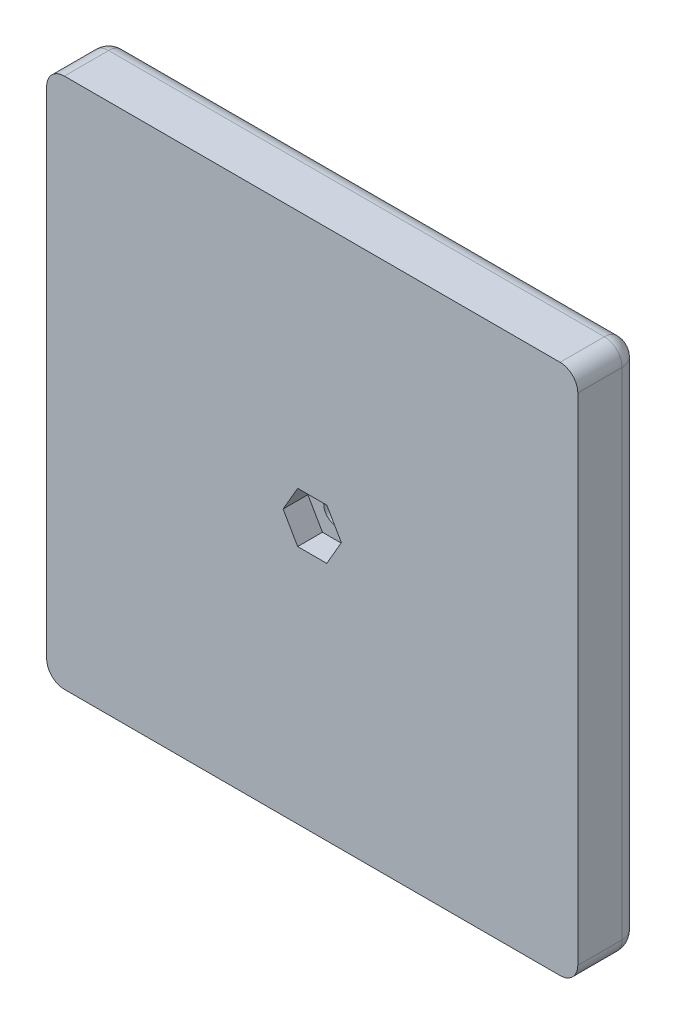
ISO-10303-21;
HEADER;
FILE_DESCRIPTION(('STEP AP214'),'2;1');
FILE_NAME('part.step','',(''),(''),'','','');
FILE_SCHEMA(('AUTOMOTIVE_DESIGN { 1 0 10303 214 1 1 1 1 }'));
ENDSEC;
DATA;
#1=APPLICATION_CONTEXT('core data for automotive mechanical design processes');
#2=APPLICATION_PROTOCOL_DEFINITION('international standard','automotive_design',2000,#1);
#3=PRODUCT_CONTEXT('',#1,'mechanical');
#4=PRODUCT('Part','Part','',(#3));
#5=PRODUCT_RELATED_PRODUCT_CATEGORY('part','',(#4));
#6=PRODUCT_DEFINITION_FORMATION('','',#4);
#7=PRODUCT_DEFINITION_CONTEXT('part definition',#1,'design');
#8=PRODUCT_DEFINITION('design','',#6,#7);
#9=PRODUCT_DEFINITION_SHAPE('','',#8);
#10=(LENGTH_UNIT() NAMED_UNIT(*) SI_UNIT(.MILLI.,.METRE.));
#11=(NAMED_UNIT(*) PLANE_ANGLE_UNIT() SI_UNIT($,.RADIAN.));
#12=(NAMED_UNIT(*) SI_UNIT($,.STERADIAN.) SOLID_ANGLE_UNIT());
#13=UNCERTAINTY_MEASURE_WITH_UNIT(LENGTH_MEASURE(1.E-05),#10,'distance_accuracy_value','');
#14=(GEOMETRIC_REPRESENTATION_CONTEXT(3) GLOBAL_UNCERTAINTY_ASSIGNED_CONTEXT((#13)) GLOBAL_UNIT_ASSIGNED_CONTEXT((#10,
#11,#12)) REPRESENTATION_CONTEXT('',''));
#15=CARTESIAN_POINT('',(0.,0.,0.));
#16=DIRECTION('',(0.,0.,1.));
#17=DIRECTION('',(1.,0.,0.));
#18=AXIS2_PLACEMENT_3D('',#15,#16,#17);
#19=CARTESIAN_POINT('',(0.,0.,17.251));
#20=DIRECTION('',(0.,0.,-1.));
#21=DIRECTION('',(-1.,0.,0.));
#22=AXIS2_PLACEMENT_3D('',#19,#20,#21);
#23=CYLINDRICAL_SURFACE('',#22,1.5);
#24=CARTESIAN_POINT('',(0.,0.,10.25));
#25=DIRECTION('',(0.,0.,-1.));
#26=DIRECTION('',(-1.,0.,0.));
#27=AXIS2_PLACEMENT_3D('',#24,#25,#26);
#28=CIRCLE('',#27,1.5);
#29=CARTESIAN_POINT('',(-1.5,0.,10.25));
#30=VERTEX_POINT('',#29);
#31=EDGE_CURVE('E240',#30,#30,#28,.T.);
#32=ORIENTED_EDGE('',*,*,#31,.T.);
#33=EDGE_LOOP('',(#32));
#34=FACE_BOUND('',#33,.T.);
#35=CARTESIAN_POINT('',(0.,0.,14.45));
#36=DIRECTION('',(0.,0.,1.));
#37=DIRECTION('',(1.,0.,0.));
#38=AXIS2_PLACEMENT_3D('',#35,#36,#37);
#39=CIRCLE('',#38,1.5);
#40=CARTESIAN_POINT('',(1.5,0.,14.45));
#41=VERTEX_POINT('',#40);
#42=EDGE_CURVE('E232',#41,#41,#39,.F.);
#43=ORIENTED_EDGE('',*,*,#42,.F.);
#44=EDGE_LOOP('',(#43));
#45=FACE_BOUND('',#44,.T.);
#46=ADVANCED_FACE('F39',(#34,#45),#23,.F.);
#47=CARTESIAN_POINT('',(11.5,-11.5,10.25));
#48=DIRECTION('',(-1.,0.,0.));
#49=DIRECTION('',(0.,0.,1.));
#50=AXIS2_PLACEMENT_3D('',#47,#48,#49);
#51=PLANE('',#50);
#52=DIRECTION('',(0.,1.,0.));
#53=VECTOR('',#52,1.);
#54=CARTESIAN_POINT('',(11.5,-11.5,0.));
#55=LINE('',#54,#53);
#56=CARTESIAN_POINT('',(11.5,-11.5,0.));
#57=VERTEX_POINT('',#56);
#58=CARTESIAN_POINT('',(11.5,11.5,0.));
#59=VERTEX_POINT('',#58);
#60=EDGE_CURVE('E257',#57,#59,#55,.T.);
#61=ORIENTED_EDGE('',*,*,#60,.T.);
#62=DIRECTION('',(0.,0.,-1.));
#63=VECTOR('',#62,1.);
#64=CARTESIAN_POINT('',(11.5,11.5,10.25));
#65=LINE('',#64,#63);
#66=CARTESIAN_POINT('',(11.5,11.5,10.25));
#67=VERTEX_POINT('',#66);
#68=EDGE_CURVE('E289',#67,#59,#65,.T.);
#69=ORIENTED_EDGE('',*,*,#68,.F.);
#70=DIRECTION('',(0.,1.,0.));
#71=VECTOR('',#70,1.);
#72=CARTESIAN_POINT('',(11.5,-11.5,10.25));
#73=LINE('',#72,#71);
#74=CARTESIAN_POINT('',(11.5,-11.5,10.25));
#75=VERTEX_POINT('',#74);
#76=EDGE_CURVE('E260',#75,#67,#73,.T.);
#77=ORIENTED_EDGE('',*,*,#76,.F.);
#78=DIRECTION('',(0.,0.,-1.));
#79=VECTOR('',#78,1.);
#80=CARTESIAN_POINT('',(11.5,-11.5,10.25));
#81=LINE('',#80,#79);
#82=EDGE_CURVE('E273',#75,#57,#81,.T.);
#83=ORIENTED_EDGE('',*,*,#82,.T.);
#84=EDGE_LOOP('',(#61,#69,#77,#83));
#85=FACE_BOUND('',#84,.T.);
#86=ADVANCED_FACE('F433',(#85),#51,.F.);
#87=CARTESIAN_POINT('',(-11.5,11.5,10.25));
#88=DIRECTION('',(0.,-1.,0.));
#89=DIRECTION('',(0.,0.,-1.));
#90=AXIS2_PLACEMENT_3D('',#87,#88,#89);
#91=PLANE('',#90);
#92=DIRECTION('',(-1.,0.,0.));
#93=VECTOR('',#92,1.);
#94=CARTESIAN_POINT('',(-11.5,11.5,0.));
#95=LINE('',#94,#93);
#96=CARTESIAN_POINT('',(-11.5,11.5,0.));
#97=VERTEX_POINT('',#96);
#98=EDGE_CURVE('E276',#59,#97,#95,.T.);
#99=ORIENTED_EDGE('',*,*,#98,.T.);
#100=DIRECTION('',(0.,0.,-1.));
#101=VECTOR('',#100,1.);
#102=CARTESIAN_POINT('',(-11.5,11.5,10.25));
#103=LINE('',#102,#101);
#104=CARTESIAN_POINT('',(-11.5,11.5,10.25));
#105=VERTEX_POINT('',#104);
#106=EDGE_CURVE('E286',#105,#97,#103,.T.);
#107=ORIENTED_EDGE('',*,*,#106,.F.);
#108=DIRECTION('',(-1.,0.,0.));
#109=VECTOR('',#108,1.);
#110=CARTESIAN_POINT('',(-11.5,11.5,10.25));
#111=LINE('',#110,#109);
#112=EDGE_CURVE('E263',#67,#105,#111,.T.);
#113=ORIENTED_EDGE('',*,*,#112,.F.);
#114=ORIENTED_EDGE('',*,*,#68,.T.);
#115=EDGE_LOOP('',(#99,#107,#113,#114));
#116=FACE_BOUND('',#115,.T.);
#117=ADVANCED_FACE('F439',(#116),#91,.F.);
#118=CARTESIAN_POINT('',(-11.5,-11.5,10.25));
#119=DIRECTION('',(1.,0.,0.));
#120=DIRECTION('',(0.,0.,-1.));
#121=AXIS2_PLACEMENT_3D('',#118,#119,#120);
#122=PLANE('',#121);
#123=DIRECTION('',(0.,-1.,0.));
#124=VECTOR('',#123,1.);
#125=CARTESIAN_POINT('',(-11.5,-11.5,0.));
#126=LINE('',#125,#124);
#127=CARTESIAN_POINT('',(-11.5,-11.5,0.));
#128=VERTEX_POINT('',#127);
#129=EDGE_CURVE('E278',#97,#128,#126,.T.);
#130=ORIENTED_EDGE('',*,*,#129,.T.);
#131=DIRECTION('',(0.,0.,-1.));
#132=VECTOR('',#131,1.);
#133=CARTESIAN_POINT('',(-11.5,-11.5,10.25));
#134=LINE('',#133,#132);
#135=CARTESIAN_POINT('',(-11.5,-11.5,10.25));
#136=VERTEX_POINT('',#135);
#137=EDGE_CURVE('E283',#136,#128,#134,.T.);
#138=ORIENTED_EDGE('',*,*,#137,.F.);
#139=DIRECTION('',(0.,-1.,0.));
#140=VECTOR('',#139,1.);
#141=CARTESIAN_POINT('',(-11.5,-11.5,10.25));
#142=LINE('',#141,#140);
#143=EDGE_CURVE('E267',#105,#136,#142,.T.);
#144=ORIENTED_EDGE('',*,*,#143,.F.);
#145=ORIENTED_EDGE('',*,*,#106,.T.);
#146=EDGE_LOOP('',(#130,#138,#144,#145));
#147=FACE_BOUND('',#146,.T.);
#148=ADVANCED_FACE('F474',(#147),#122,.F.);
#149=CARTESIAN_POINT('',(-11.5,-11.5,10.25));
#150=DIRECTION('',(0.,1.,0.));
#151=DIRECTION('',(0.,0.,1.));
#152=AXIS2_PLACEMENT_3D('',#149,#150,#151);
#153=PLANE('',#152);
#154=DIRECTION('',(1.,0.,0.));
#155=VECTOR('',#154,1.);
#156=CARTESIAN_POINT('',(-11.5,-11.5,0.));
#157=LINE('',#156,#155);
#158=EDGE_CURVE('E264',#128,#57,#157,.T.);
#159=ORIENTED_EDGE('',*,*,#158,.T.);
#160=ORIENTED_EDGE('',*,*,#82,.F.);
#161=DIRECTION('',(1.,0.,0.));
#162=VECTOR('',#161,1.);
#163=CARTESIAN_POINT('',(-11.5,-11.5,10.25));
#164=LINE('',#163,#162);
#165=EDGE_CURVE('E270',#136,#75,#164,.T.);
#166=ORIENTED_EDGE('',*,*,#165,.F.);
#167=ORIENTED_EDGE('',*,*,#137,.T.);
#168=EDGE_LOOP('',(#159,#160,#166,#167));
#169=FACE_BOUND('',#168,.T.);
#170=ADVANCED_FACE('F470',(#169),#153,.F.);
#171=CARTESIAN_POINT('',(0.,0.,0.));
#172=DIRECTION('',(0.,0.,-1.));
#173=DIRECTION('',(-1.,0.,0.));
#174=AXIS2_PLACEMENT_3D('',#171,#172,#173);
#175=PLANE('',#174);
#176=CARTESIAN_POINT('',(0.,0.,0.));
#177=DIRECTION('',(0.,0.,-1.));
#178=DIRECTION('',(-1.,0.,0.));
#179=AXIS2_PLACEMENT_3D('',#176,#177,#178);
#180=CIRCLE('',#179,4.2);
#181=CARTESIAN_POINT('',(-4.2,0.,0.));
#182=VERTEX_POINT('',#181);
#183=EDGE_CURVE('E254',#182,#182,#180,.T.);
#184=ORIENTED_EDGE('',*,*,#183,.F.);
#185=EDGE_LOOP('',(#184));
#186=FACE_BOUND('',#185,.T.);
#187=ORIENTED_EDGE('',*,*,#60,.F.);
#188=ORIENTED_EDGE('',*,*,#158,.F.);
#189=ORIENTED_EDGE('',*,*,#129,.F.);
#190=ORIENTED_EDGE('',*,*,#98,.F.);
#191=EDGE_LOOP('',(#187,#188,#189,#190));
#192=FACE_BOUND('',#191,.T.);
#193=ADVANCED_FACE('F466',(#186,#192),#175,.T.);
#194=CARTESIAN_POINT('',(0.,0.,10.251));
#195=DIRECTION('',(0.,0.,-1.));
#196=DIRECTION('',(-1.,0.,0.));
#197=AXIS2_PLACEMENT_3D('',#194,#195,#196);
#198=CYLINDRICAL_SURFACE('',#197,4.2);
#199=ORIENTED_EDGE('',*,*,#183,.T.);
#200=EDGE_LOOP('',(#199));
#201=FACE_BOUND('',#200,.T.);
#202=CARTESIAN_POINT('',(0.,0.,10.25));
#203=DIRECTION('',(0.,0.,-1.));
#204=DIRECTION('',(-1.,0.,0.));
#205=AXIS2_PLACEMENT_3D('',#202,#203,#204);
#206=CIRCLE('',#205,4.2);
#207=CARTESIAN_POINT('',(-4.2,0.,10.25));
#208=VERTEX_POINT('',#207);
#209=EDGE_CURVE('E253',#208,#208,#206,.F.);
#210=ORIENTED_EDGE('',*,*,#209,.T.);
#211=EDGE_LOOP('',(#210));
#212=FACE_BOUND('',#211,.T.);
#213=ADVANCED_FACE('F448',(#201,#212),#198,.F.);
#214=CARTESIAN_POINT('',(0.,0.,17.25));
#215=DIRECTION('',(0.,0.,1.));
#216=DIRECTION('',(1.,0.,0.));
#217=AXIS2_PLACEMENT_3D('',#214,#215,#216);
#218=PLANE('',#217);
#219=DIRECTION('',(0.5,0.866025403784439,0.));
#220=VECTOR('',#219,1.);
#221=CARTESIAN_POINT('',(1.64544826719043,-2.85,17.25));
#222=LINE('',#221,#220);
#223=CARTESIAN_POINT('',(1.64544826719043,-2.85,17.25));
#224=VERTEX_POINT('',#223);
#225=CARTESIAN_POINT('',(3.29089653438087,0.,17.25));
#226=VERTEX_POINT('',#225);
#227=EDGE_CURVE('E186',#224,#226,#222,.T.);
#228=ORIENTED_EDGE('',*,*,#227,.F.);
#229=DIRECTION('',(1.,0.,0.));
#230=VECTOR('',#229,1.);
#231=CARTESIAN_POINT('',(-1.64544826719043,-2.85,17.25));
#232=LINE('',#231,#230);
#233=CARTESIAN_POINT('',(-1.64544826719043,-2.85,17.25));
#234=VERTEX_POINT('',#233);
#235=EDGE_CURVE('E205',#234,#224,#232,.T.);
#236=ORIENTED_EDGE('',*,*,#235,.F.);
#237=DIRECTION('',(0.5,-0.866025403784438,0.));
#238=VECTOR('',#237,1.);
#239=CARTESIAN_POINT('',(-3.29089653438087,0.,17.25));
#240=LINE('',#239,#238);
#241=CARTESIAN_POINT('',(-3.29089653438087,0.,17.25));
#242=VERTEX_POINT('',#241);
#243=EDGE_CURVE('E208',#242,#234,#240,.T.);
#244=ORIENTED_EDGE('',*,*,#243,.F.);
#245=DIRECTION('',(-0.5,-0.866025403784438,0.));
#246=VECTOR('',#245,1.);
#247=CARTESIAN_POINT('',(-1.64544826719043,2.85,17.25));
#248=LINE('',#247,#246);
#249=CARTESIAN_POINT('',(-1.64544826719043,2.85,17.25));
#250=VERTEX_POINT('',#249);
#251=EDGE_CURVE('E225',#250,#242,#248,.T.);
#252=ORIENTED_EDGE('',*,*,#251,.F.);
#253=DIRECTION('',(-1.,0.,0.));
#254=VECTOR('',#253,1.);
#255=CARTESIAN_POINT('',(1.64544826719043,2.85,17.25));
#256=LINE('',#255,#254);
#257=CARTESIAN_POINT('',(1.64544826719043,2.85,17.25));
#258=VERTEX_POINT('',#257);
#259=EDGE_CURVE('E222',#258,#250,#256,.T.);
#260=ORIENTED_EDGE('',*,*,#259,.F.);
#261=DIRECTION('',(-0.5,0.866025403784438,0.));
#262=VECTOR('',#261,1.);
#263=CARTESIAN_POINT('',(3.29089653438087,0.,17.25));
#264=LINE('',#263,#262);
#265=EDGE_CURVE('E219',#226,#258,#264,.T.);
#266=ORIENTED_EDGE('',*,*,#265,.F.);
#267=EDGE_LOOP('',(#228,#236,#244,#252,#260,#266));
#268=FACE_BOUND('',#267,.T.);
#269=DIRECTION('',(1.,0.,0.));
#270=VECTOR('',#269,1.);
#271=CARTESIAN_POINT('',(30.,-30.,17.25));
#272=LINE('',#271,#270);
#273=CARTESIAN_POINT('',(-28.,-30.,17.25));
#274=VERTEX_POINT('',#273);
#275=CARTESIAN_POINT('',(28.,-30.,17.25));
#276=VERTEX_POINT('',#275);
#277=EDGE_CURVE('E246',#274,#276,#272,.T.);
#278=ORIENTED_EDGE('',*,*,#277,.T.);
#279=CARTESIAN_POINT('',(28.,-28.,17.25));
#280=DIRECTION('',(0.,0.,1.));
#281=DIRECTION('',(1.,0.,0.));
#282=AXIS2_PLACEMENT_3D('',#279,#280,#281);
#283=CIRCLE('',#282,2.);
#284=CARTESIAN_POINT('',(30.,-28.,17.25));
#285=VERTEX_POINT('',#284);
#286=EDGE_CURVE('E350',#276,#285,#283,.T.);
#287=ORIENTED_EDGE('',*,*,#286,.T.);
#288=DIRECTION('',(0.,1.,0.));
#289=VECTOR('',#288,1.);
#290=CARTESIAN_POINT('',(30.,-30.,17.25));
#291=LINE('',#290,#289);
#292=CARTESIAN_POINT('',(30.,28.,17.25));
#293=VERTEX_POINT('',#292);
#294=EDGE_CURVE('E249',#285,#293,#291,.T.);
#295=ORIENTED_EDGE('',*,*,#294,.T.);
#296=CARTESIAN_POINT('',(28.,28.,17.25));
#297=DIRECTION('',(0.,0.,1.));
#298=DIRECTION('',(1.,0.,0.));
#299=AXIS2_PLACEMENT_3D('',#296,#297,#298);
#300=CIRCLE('',#299,2.);
#301=CARTESIAN_POINT('',(28.,30.,17.25));
#302=VERTEX_POINT('',#301);
#303=EDGE_CURVE('E63',#293,#302,#300,.T.);
#304=ORIENTED_EDGE('',*,*,#303,.T.);
#305=DIRECTION('',(-1.,0.,0.));
#306=VECTOR('',#305,1.);
#307=CARTESIAN_POINT('',(30.,30.,17.25));
#308=LINE('',#307,#306);
#309=CARTESIAN_POINT('',(-28.,30.,17.25));
#310=VERTEX_POINT('',#309);
#311=EDGE_CURVE('E251',#302,#310,#308,.T.);
#312=ORIENTED_EDGE('',*,*,#311,.T.);
#313=CARTESIAN_POINT('',(-28.,28.,17.25));
#314=DIRECTION('',(0.,0.,1.));
#315=DIRECTION('',(1.,0.,0.));
#316=AXIS2_PLACEMENT_3D('',#313,#314,#315);
#317=CIRCLE('',#316,2.);
#318=CARTESIAN_POINT('',(-30.,28.,17.25));
#319=VERTEX_POINT('',#318);
#320=EDGE_CURVE('E347',#310,#319,#317,.T.);
#321=ORIENTED_EDGE('',*,*,#320,.T.);
#322=DIRECTION('',(0.,-1.,0.));
#323=VECTOR('',#322,1.);
#324=CARTESIAN_POINT('',(-30.,-30.,17.25));
#325=LINE('',#324,#323);
#326=CARTESIAN_POINT('',(-30.,-28.,17.25));
#327=VERTEX_POINT('',#326);
#328=EDGE_CURVE('E243',#319,#327,#325,.T.);
#329=ORIENTED_EDGE('',*,*,#328,.T.);
#330=CARTESIAN_POINT('',(-28.,-28.,17.25));
#331=DIRECTION('',(0.,0.,1.));
#332=DIRECTION('',(1.,0.,0.));
#333=AXIS2_PLACEMENT_3D('',#330,#331,#332);
#334=CIRCLE('',#333,2.);
#335=EDGE_CURVE('E345',#327,#274,#334,.T.);
#336=ORIENTED_EDGE('',*,*,#335,.T.);
#337=EDGE_LOOP('',(#278,#287,#295,#304,#312,#321,#329,#336));
#338=FACE_BOUND('',#337,.T.);
#339=ADVANCED_FACE('F378',(#268,#338),#218,.T.);
#340=CARTESIAN_POINT('',(30.,30.,17.25));
#341=DIRECTION('',(0.,-1.,0.));
#342=DIRECTION('',(1.,0.,0.));
#343=AXIS2_PLACEMENT_3D('',#340,#341,#342);
#344=PLANE('',#343);
#345=ORIENTED_EDGE('',*,*,#311,.F.);
#346=DIRECTION('',(0.,0.,-1.));
#347=VECTOR('',#346,1.);
#348=CARTESIAN_POINT('',(28.,30.,17.25));
#349=LINE('',#348,#347);
#350=CARTESIAN_POINT('',(28.,30.,12.25));
#351=VERTEX_POINT('',#350);
#352=EDGE_CURVE('E353',#302,#351,#349,.T.);
#353=ORIENTED_EDGE('',*,*,#352,.T.);
#354=DIRECTION('',(-1.,0.,0.));
#355=VECTOR('',#354,1.);
#356=CARTESIAN_POINT('',(30.,30.,12.25));
#357=LINE('',#356,#355);
#358=CARTESIAN_POINT('',(-28.,30.,12.25));
#359=VERTEX_POINT('',#358);
#360=EDGE_CURVE('E315',#351,#359,#357,.T.);
#361=ORIENTED_EDGE('',*,*,#360,.T.);
#362=DIRECTION('',(0.,0.,-1.));
#363=VECTOR('',#362,1.);
#364=CARTESIAN_POINT('',(-28.,30.,17.25));
#365=LINE('',#364,#363);
#366=EDGE_CURVE('E56',#359,#310,#365,.F.);
#367=ORIENTED_EDGE('',*,*,#366,.T.);
#368=EDGE_LOOP('',(#345,#353,#361,#367));
#369=FACE_BOUND('',#368,.T.);
#370=ADVANCED_FACE('F392',(#369),#344,.F.);
#371=CARTESIAN_POINT('',(30.,-30.,17.25));
#372=DIRECTION('',(-1.,0.,0.));
#373=DIRECTION('',(0.,0.,1.));
#374=AXIS2_PLACEMENT_3D('',#371,#372,#373);
#375=PLANE('',#374);
#376=ORIENTED_EDGE('',*,*,#294,.F.);
#377=DIRECTION('',(0.,0.,-1.));
#378=VECTOR('',#377,1.);
#379=CARTESIAN_POINT('',(30.,-28.,17.25));
#380=LINE('',#379,#378);
#381=CARTESIAN_POINT('',(30.,-28.,12.25));
#382=VERTEX_POINT('',#381);
#383=EDGE_CURVE('E339',#285,#382,#380,.T.);
#384=ORIENTED_EDGE('',*,*,#383,.T.);
#385=DIRECTION('',(0.,1.,0.));
#386=VECTOR('',#385,1.);
#387=CARTESIAN_POINT('',(30.,-30.,12.25));
#388=LINE('',#387,#386);
#389=CARTESIAN_POINT('',(30.,28.,12.25));
#390=VERTEX_POINT('',#389);
#391=EDGE_CURVE('E292',#382,#390,#388,.T.);
#392=ORIENTED_EDGE('',*,*,#391,.T.);
#393=DIRECTION('',(0.,0.,-1.));
#394=VECTOR('',#393,1.);
#395=CARTESIAN_POINT('',(30.,28.,17.25));
#396=LINE('',#395,#394);
#397=EDGE_CURVE('E337',#390,#293,#396,.F.);
#398=ORIENTED_EDGE('',*,*,#397,.T.);
#399=EDGE_LOOP('',(#376,#384,#392,#398));
#400=FACE_BOUND('',#399,.T.);
#401=ADVANCED_FACE('F456',(#400),#375,.F.);
#402=CARTESIAN_POINT('',(30.,-30.,17.25));
#403=DIRECTION('',(0.,1.,0.));
#404=DIRECTION('',(-1.,0.,0.));
#405=AXIS2_PLACEMENT_3D('',#402,#403,#404);
#406=PLANE('',#405);
#407=DIRECTION('',(1.,0.,0.));
#408=VECTOR('',#407,1.);
#409=CARTESIAN_POINT('',(30.,-30.,12.25));
#410=LINE('',#409,#408);
#411=CARTESIAN_POINT('',(-28.,-30.,12.25));
#412=VERTEX_POINT('',#411);
#413=CARTESIAN_POINT('',(28.,-30.,12.25));
#414=VERTEX_POINT('',#413);
#415=EDGE_CURVE('E309',#412,#414,#410,.T.);
#416=ORIENTED_EDGE('',*,*,#415,.T.);
#417=DIRECTION('',(0.,0.,-1.));
#418=VECTOR('',#417,1.);
#419=CARTESIAN_POINT('',(28.,-30.,17.25));
#420=LINE('',#419,#418);
#421=EDGE_CURVE('E343',#414,#276,#420,.F.);
#422=ORIENTED_EDGE('',*,*,#421,.T.);
#423=ORIENTED_EDGE('',*,*,#277,.F.);
#424=DIRECTION('',(0.,0.,-1.));
#425=VECTOR('',#424,1.);
#426=CARTESIAN_POINT('',(-28.,-30.,17.25));
#427=LINE('',#426,#425);
#428=EDGE_CURVE('E341',#274,#412,#427,.T.);
#429=ORIENTED_EDGE('',*,*,#428,.T.);
#430=EDGE_LOOP('',(#416,#422,#423,#429));
#431=FACE_BOUND('',#430,.T.);
#432=ADVANCED_FACE('F417',(#431),#406,.F.);
#433=CARTESIAN_POINT('',(-30.,-30.,17.25));
#434=DIRECTION('',(1.,0.,0.));
#435=DIRECTION('',(0.,0.,-1.));
#436=AXIS2_PLACEMENT_3D('',#433,#434,#435);
#437=PLANE('',#436);
#438=ORIENTED_EDGE('',*,*,#328,.F.);
#439=DIRECTION('',(0.,0.,-1.));
#440=VECTOR('',#439,1.);
#441=CARTESIAN_POINT('',(-30.,28.,17.25));
#442=LINE('',#441,#440);
#443=CARTESIAN_POINT('',(-30.,28.,12.25));
#444=VERTEX_POINT('',#443);
#445=EDGE_CURVE('E11',#319,#444,#442,.T.);
#446=ORIENTED_EDGE('',*,*,#445,.T.);
#447=DIRECTION('',(0.,-1.,0.));
#448=VECTOR('',#447,1.);
#449=CARTESIAN_POINT('',(-30.,-30.,12.25));
#450=LINE('',#449,#448);
#451=CARTESIAN_POINT('',(-30.,-28.,12.25));
#452=VERTEX_POINT('',#451);
#453=EDGE_CURVE('E312',#444,#452,#450,.T.);
#454=ORIENTED_EDGE('',*,*,#453,.T.);
#455=DIRECTION('',(0.,0.,-1.));
#456=VECTOR('',#455,1.);
#457=CARTESIAN_POINT('',(-30.,-28.,17.25));
#458=LINE('',#457,#456);
#459=EDGE_CURVE('E48',#452,#327,#458,.F.);
#460=ORIENTED_EDGE('',*,*,#459,.T.);
#461=EDGE_LOOP('',(#438,#446,#454,#460));
#462=FACE_BOUND('',#461,.T.);
#463=ADVANCED_FACE('F375',(#462),#437,.F.);
#464=CARTESIAN_POINT('',(0.,0.,10.25));
#465=DIRECTION('',(0.,0.,1.));
#466=DIRECTION('',(1.,0.,0.));
#467=AXIS2_PLACEMENT_3D('',#464,#465,#466);
#468=PLANE('',#467);
#469=DIRECTION('',(-1.,0.,0.));
#470=VECTOR('',#469,1.);
#471=CARTESIAN_POINT('',(0.,28.,10.25));
#472=LINE('',#471,#470);
#473=CARTESIAN_POINT('',(-28.,28.,10.25));
#474=VERTEX_POINT('',#473);
#475=CARTESIAN_POINT('',(28.,28.,10.25));
#476=VERTEX_POINT('',#475);
#477=EDGE_CURVE('E297',#474,#476,#472,.F.);
#478=ORIENTED_EDGE('',*,*,#477,.T.);
#479=DIRECTION('',(0.,1.,0.));
#480=VECTOR('',#479,1.);
#481=CARTESIAN_POINT('',(28.,0.,10.25));
#482=LINE('',#481,#480);
#483=CARTESIAN_POINT('',(28.,-28.,10.25));
#484=VERTEX_POINT('',#483);
#485=EDGE_CURVE('E306',#476,#484,#482,.F.);
#486=ORIENTED_EDGE('',*,*,#485,.T.);
#487=DIRECTION('',(1.,0.,0.));
#488=VECTOR('',#487,1.);
#489=CARTESIAN_POINT('',(0.,-28.,10.25));
#490=LINE('',#489,#488);
#491=CARTESIAN_POINT('',(-28.,-28.,10.25));
#492=VERTEX_POINT('',#491);
#493=EDGE_CURVE('E303',#484,#492,#490,.F.);
#494=ORIENTED_EDGE('',*,*,#493,.T.);
#495=DIRECTION('',(0.,-1.,0.));
#496=VECTOR('',#495,1.);
#497=CARTESIAN_POINT('',(-28.,0.,10.25));
#498=LINE('',#497,#496);
#499=EDGE_CURVE('E300',#492,#474,#498,.F.);
#500=ORIENTED_EDGE('',*,*,#499,.T.);
#501=EDGE_LOOP('',(#478,#486,#494,#500));
#502=FACE_BOUND('',#501,.T.);
#503=ORIENTED_EDGE('',*,*,#165,.T.);
#504=ORIENTED_EDGE('',*,*,#76,.T.);
#505=ORIENTED_EDGE('',*,*,#112,.T.);
#506=ORIENTED_EDGE('',*,*,#143,.T.);
#507=EDGE_LOOP('',(#503,#504,#505,#506));
#508=FACE_BOUND('',#507,.T.);
#509=ADVANCED_FACE('F403',(#502,#508),#468,.F.);
#510=ORIENTED_EDGE('',*,*,#31,.F.);
#511=EDGE_LOOP('',(#510));
#512=FACE_BOUND('',#511,.T.);
#513=ORIENTED_EDGE('',*,*,#209,.F.);
#514=EDGE_LOOP('',(#513));
#515=FACE_BOUND('',#514,.T.);
#516=ADVANCED_FACE('F450',(#512,#515),#468,.F.);
#517=CARTESIAN_POINT('',(0.,0.,14.45));
#518=DIRECTION('',(0.,0.,1.));
#519=DIRECTION('',(1.,0.,0.));
#520=AXIS2_PLACEMENT_3D('',#517,#518,#519);
#521=PLANE('',#520);
#522=DIRECTION('',(0.5,0.866025403784439,0.));
#523=VECTOR('',#522,1.);
#524=CARTESIAN_POINT('',(1.64544826719043,-2.85,14.45));
#525=LINE('',#524,#523);
#526=CARTESIAN_POINT('',(1.64544826719043,-2.85,14.45));
#527=VERTEX_POINT('',#526);
#528=CARTESIAN_POINT('',(3.29089653438087,0.,14.45));
#529=VERTEX_POINT('',#528);
#530=EDGE_CURVE('E183',#527,#529,#525,.T.);
#531=ORIENTED_EDGE('',*,*,#530,.T.);
#532=DIRECTION('',(-0.5,0.866025403784438,0.));
#533=VECTOR('',#532,1.);
#534=CARTESIAN_POINT('',(3.29089653438087,0.,14.45));
#535=LINE('',#534,#533);
#536=CARTESIAN_POINT('',(1.64544826719043,2.85,14.45));
#537=VERTEX_POINT('',#536);
#538=EDGE_CURVE('E194',#529,#537,#535,.T.);
#539=ORIENTED_EDGE('',*,*,#538,.T.);
#540=DIRECTION('',(-1.,0.,0.));
#541=VECTOR('',#540,1.);
#542=CARTESIAN_POINT('',(1.64544826719043,2.85,14.45));
#543=LINE('',#542,#541);
#544=CARTESIAN_POINT('',(-1.64544826719043,2.85,14.45));
#545=VERTEX_POINT('',#544);
#546=EDGE_CURVE('E199',#537,#545,#543,.T.);
#547=ORIENTED_EDGE('',*,*,#546,.T.);
#548=DIRECTION('',(-0.5,-0.866025403784438,0.));
#549=VECTOR('',#548,1.);
#550=CARTESIAN_POINT('',(-1.64544826719043,2.85,14.45));
#551=LINE('',#550,#549);
#552=CARTESIAN_POINT('',(-3.29089653438087,0.,14.45));
#553=VERTEX_POINT('',#552);
#554=EDGE_CURVE('E212',#545,#553,#551,.T.);
#555=ORIENTED_EDGE('',*,*,#554,.T.);
#556=DIRECTION('',(0.5,-0.866025403784438,0.));
#557=VECTOR('',#556,1.);
#558=CARTESIAN_POINT('',(-3.29089653438087,0.,14.45));
#559=LINE('',#558,#557);
#560=CARTESIAN_POINT('',(-1.64544826719043,-2.85,14.45));
#561=VERTEX_POINT('',#560);
#562=EDGE_CURVE('E215',#553,#561,#559,.T.);
#563=ORIENTED_EDGE('',*,*,#562,.T.);
#564=DIRECTION('',(1.,0.,0.));
#565=VECTOR('',#564,1.);
#566=CARTESIAN_POINT('',(-1.64544826719043,-2.85,14.45));
#567=LINE('',#566,#565);
#568=EDGE_CURVE('E191',#561,#527,#567,.T.);
#569=ORIENTED_EDGE('',*,*,#568,.T.);
#570=EDGE_LOOP('',(#531,#539,#547,#555,#563,#569));
#571=FACE_BOUND('',#570,.T.);
#572=ORIENTED_EDGE('',*,*,#42,.T.);
#573=EDGE_LOOP('',(#572));
#574=FACE_BOUND('',#573,.T.);
#575=ADVANCED_FACE('F201',(#571,#574),#521,.T.);
#576=CARTESIAN_POINT('',(1.64544826719043,-2.85,14.45));
#577=DIRECTION('',(0.866025403784439,-0.5,0.));
#578=DIRECTION('',(0.5,0.866025403784439,0.));
#579=AXIS2_PLACEMENT_3D('',#576,#577,#578);
#580=PLANE('',#579);
#581=ORIENTED_EDGE('',*,*,#227,.T.);
#582=DIRECTION('',(0.,0.,1.));
#583=VECTOR('',#582,1.);
#584=CARTESIAN_POINT('',(3.29089653438087,0.,14.45));
#585=LINE('',#584,#583);
#586=EDGE_CURVE('E179',#529,#226,#585,.T.);
#587=ORIENTED_EDGE('',*,*,#586,.F.);
#588=ORIENTED_EDGE('',*,*,#530,.F.);
#589=DIRECTION('',(0.,0.,1.));
#590=VECTOR('',#589,1.);
#591=CARTESIAN_POINT('',(1.64544826719043,-2.85,14.45));
#592=LINE('',#591,#590);
#593=EDGE_CURVE('E230',#527,#224,#592,.T.);
#594=ORIENTED_EDGE('',*,*,#593,.T.);
#595=EDGE_LOOP('',(#581,#587,#588,#594));
#596=FACE_BOUND('',#595,.T.);
#597=ADVANCED_FACE('F181',(#596),#580,.F.);
#598=CARTESIAN_POINT('',(-1.64544826719043,-2.85,14.45));
#599=DIRECTION('',(0.,-1.,0.));
#600=DIRECTION('',(0.,0.,-1.));
#601=AXIS2_PLACEMENT_3D('',#598,#599,#600);
#602=PLANE('',#601);
#603=ORIENTED_EDGE('',*,*,#235,.T.);
#604=ORIENTED_EDGE('',*,*,#593,.F.);
#605=ORIENTED_EDGE('',*,*,#568,.F.);
#606=DIRECTION('',(0.,0.,1.));
#607=VECTOR('',#606,1.);
#608=CARTESIAN_POINT('',(-1.64544826719043,-2.85,14.45));
#609=LINE('',#608,#607);
#610=EDGE_CURVE('E233',#561,#234,#609,.T.);
#611=ORIENTED_EDGE('',*,*,#610,.T.);
#612=EDGE_LOOP('',(#603,#604,#605,#611));
#613=FACE_BOUND('',#612,.T.);
#614=ADVANCED_FACE('F505',(#613),#602,.F.);
#615=CARTESIAN_POINT('',(-3.29089653438087,0.,14.45));
#616=DIRECTION('',(-0.866025403784438,-0.5,0.));
#617=DIRECTION('',(0.5,-0.866025403784438,0.));
#618=AXIS2_PLACEMENT_3D('',#615,#616,#617);
#619=PLANE('',#618);
#620=ORIENTED_EDGE('',*,*,#243,.T.);
#621=ORIENTED_EDGE('',*,*,#610,.F.);
#622=ORIENTED_EDGE('',*,*,#562,.F.);
#623=DIRECTION('',(0.,0.,1.));
#624=VECTOR('',#623,1.);
#625=CARTESIAN_POINT('',(-3.29089653438087,0.,14.45));
#626=LINE('',#625,#624);
#627=EDGE_CURVE('E235',#553,#242,#626,.T.);
#628=ORIENTED_EDGE('',*,*,#627,.T.);
#629=EDGE_LOOP('',(#620,#621,#622,#628));
#630=FACE_BOUND('',#629,.T.);
#631=ADVANCED_FACE('F501',(#630),#619,.F.);
#632=CARTESIAN_POINT('',(-1.64544826719043,2.85,14.45));
#633=DIRECTION('',(-0.866025403784439,0.5,0.));
#634=DIRECTION('',(-0.5,-0.866025403784439,0.));
#635=AXIS2_PLACEMENT_3D('',#632,#633,#634);
#636=PLANE('',#635);
#637=ORIENTED_EDGE('',*,*,#251,.T.);
#638=ORIENTED_EDGE('',*,*,#627,.F.);
#639=ORIENTED_EDGE('',*,*,#554,.F.);
#640=DIRECTION('',(0.,0.,1.));
#641=VECTOR('',#640,1.);
#642=CARTESIAN_POINT('',(-1.64544826719043,2.85,14.45));
#643=LINE('',#642,#641);
#644=EDGE_CURVE('E237',#545,#250,#643,.T.);
#645=ORIENTED_EDGE('',*,*,#644,.T.);
#646=EDGE_LOOP('',(#637,#638,#639,#645));
#647=FACE_BOUND('',#646,.T.);
#648=ADVANCED_FACE('F495',(#647),#636,.F.);
#649=CARTESIAN_POINT('',(1.64544826719043,2.85,14.45));
#650=DIRECTION('',(0.,1.,0.));
#651=DIRECTION('',(0.,0.,1.));
#652=AXIS2_PLACEMENT_3D('',#649,#650,#651);
#653=PLANE('',#652);
#654=ORIENTED_EDGE('',*,*,#259,.T.);
#655=ORIENTED_EDGE('',*,*,#644,.F.);
#656=ORIENTED_EDGE('',*,*,#546,.F.);
#657=DIRECTION('',(0.,0.,1.));
#658=VECTOR('',#657,1.);
#659=CARTESIAN_POINT('',(1.64544826719043,2.85,14.45));
#660=LINE('',#659,#658);
#661=EDGE_CURVE('E190',#537,#258,#660,.T.);
#662=ORIENTED_EDGE('',*,*,#661,.T.);
#663=EDGE_LOOP('',(#654,#655,#656,#662));
#664=FACE_BOUND('',#663,.T.);
#665=ADVANCED_FACE('F491',(#664),#653,.F.);
#666=CARTESIAN_POINT('',(3.29089653438087,0.,14.45));
#667=DIRECTION('',(0.866025403784438,0.5,0.));
#668=DIRECTION('',(-0.5,0.866025403784439,0.));
#669=AXIS2_PLACEMENT_3D('',#666,#667,#668);
#670=PLANE('',#669);
#671=ORIENTED_EDGE('',*,*,#265,.T.);
#672=ORIENTED_EDGE('',*,*,#661,.F.);
#673=ORIENTED_EDGE('',*,*,#538,.F.);
#674=ORIENTED_EDGE('',*,*,#586,.T.);
#675=EDGE_LOOP('',(#671,#672,#673,#674));
#676=FACE_BOUND('',#675,.T.);
#677=ADVANCED_FACE('F195',(#676),#670,.F.);
#678=CARTESIAN_POINT('',(-28.,-30.,12.25));
#679=DIRECTION('',(0.,-1.,0.));
#680=DIRECTION('',(0.,0.,-1.));
#681=AXIS2_PLACEMENT_3D('',#678,#679,#680);
#682=CYLINDRICAL_SURFACE('',#681,2.);
#683=ORIENTED_EDGE('',*,*,#453,.F.);
#684=CARTESIAN_POINT('',(-28.,28.,12.25));
#685=DIRECTION('',(0.,-1.,0.));
#686=DIRECTION('',(0.,0.,-1.));
#687=AXIS2_PLACEMENT_3D('',#684,#685,#686);
#688=CIRCLE('',#687,2.);
#689=EDGE_CURVE('E335',#444,#474,#688,.T.);
#690=ORIENTED_EDGE('',*,*,#689,.T.);
#691=ORIENTED_EDGE('',*,*,#499,.F.);
#692=CARTESIAN_POINT('',(-28.,-28.,12.25));
#693=DIRECTION('',(0.,-1.,0.));
#694=DIRECTION('',(0.,0.,-1.));
#695=AXIS2_PLACEMENT_3D('',#692,#693,#694);
#696=CIRCLE('',#695,2.);
#697=EDGE_CURVE('E333',#492,#452,#696,.F.);
#698=ORIENTED_EDGE('',*,*,#697,.T.);
#699=EDGE_LOOP('',(#683,#690,#691,#698));
#700=FACE_BOUND('',#699,.T.);
#701=ADVANCED_FACE('F384',(#700),#682,.T.);
#702=CARTESIAN_POINT('',(30.,-28.,12.25));
#703=DIRECTION('',(1.,0.,0.));
#704=DIRECTION('',(0.,1.,0.));
#705=AXIS2_PLACEMENT_3D('',#702,#703,#704);
#706=CYLINDRICAL_SURFACE('',#705,2.);
#707=ORIENTED_EDGE('',*,*,#493,.F.);
#708=CARTESIAN_POINT('',(28.,-28.,12.25));
#709=DIRECTION('',(1.,0.,0.));
#710=DIRECTION('',(0.,1.,0.));
#711=AXIS2_PLACEMENT_3D('',#708,#709,#710);
#712=CIRCLE('',#711,2.);
#713=EDGE_CURVE('E326',#484,#414,#712,.F.);
#714=ORIENTED_EDGE('',*,*,#713,.T.);
#715=ORIENTED_EDGE('',*,*,#415,.F.);
#716=CARTESIAN_POINT('',(-28.,-28.,12.25));
#717=DIRECTION('',(1.,0.,0.));
#718=DIRECTION('',(0.,1.,0.));
#719=AXIS2_PLACEMENT_3D('',#716,#717,#718);
#720=CIRCLE('',#719,2.);
#721=EDGE_CURVE('E323',#412,#492,#720,.T.);
#722=ORIENTED_EDGE('',*,*,#721,.T.);
#723=EDGE_LOOP('',(#707,#714,#715,#722));
#724=FACE_BOUND('',#723,.T.);
#725=ADVANCED_FACE('F413',(#724),#706,.T.);
#726=CARTESIAN_POINT('',(30.,28.,12.25));
#727=DIRECTION('',(-1.,0.,0.));
#728=DIRECTION('',(0.,-1.,0.));
#729=AXIS2_PLACEMENT_3D('',#726,#727,#728);
#730=CYLINDRICAL_SURFACE('',#729,2.);
#731=ORIENTED_EDGE('',*,*,#360,.F.);
#732=CARTESIAN_POINT('',(28.,28.,12.25));
#733=DIRECTION('',(-1.,0.,0.));
#734=DIRECTION('',(0.,-1.,0.));
#735=AXIS2_PLACEMENT_3D('',#732,#733,#734);
#736=CIRCLE('',#735,2.);
#737=EDGE_CURVE('E331',#351,#476,#736,.T.);
#738=ORIENTED_EDGE('',*,*,#737,.T.);
#739=ORIENTED_EDGE('',*,*,#477,.F.);
#740=CARTESIAN_POINT('',(-28.,28.,12.25));
#741=DIRECTION('',(-1.,0.,0.));
#742=DIRECTION('',(0.,-1.,0.));
#743=AXIS2_PLACEMENT_3D('',#740,#741,#742);
#744=CIRCLE('',#743,2.);
#745=EDGE_CURVE('E328',#474,#359,#744,.F.);
#746=ORIENTED_EDGE('',*,*,#745,.T.);
#747=EDGE_LOOP('',(#731,#738,#739,#746));
#748=FACE_BOUND('',#747,.T.);
#749=ADVANCED_FACE('F390',(#748),#730,.T.);
#750=CARTESIAN_POINT('',(28.,-30.,12.25));
#751=DIRECTION('',(0.,1.,0.));
#752=DIRECTION('',(0.,0.,1.));
#753=AXIS2_PLACEMENT_3D('',#750,#751,#752);
#754=CYLINDRICAL_SURFACE('',#753,2.);
#755=ORIENTED_EDGE('',*,*,#391,.F.);
#756=CARTESIAN_POINT('',(28.,-28.,12.25));
#757=DIRECTION('',(0.,1.,0.));
#758=DIRECTION('',(0.,0.,1.));
#759=AXIS2_PLACEMENT_3D('',#756,#757,#758);
#760=CIRCLE('',#759,2.);
#761=EDGE_CURVE('E320',#382,#484,#760,.T.);
#762=ORIENTED_EDGE('',*,*,#761,.T.);
#763=ORIENTED_EDGE('',*,*,#485,.F.);
#764=CARTESIAN_POINT('',(28.,28.,12.25));
#765=DIRECTION('',(0.,1.,0.));
#766=DIRECTION('',(0.,0.,1.));
#767=AXIS2_PLACEMENT_3D('',#764,#765,#766);
#768=CIRCLE('',#767,2.);
#769=EDGE_CURVE('E317',#476,#390,#768,.F.);
#770=ORIENTED_EDGE('',*,*,#769,.T.);
#771=EDGE_LOOP('',(#755,#762,#763,#770));
#772=FACE_BOUND('',#771,.T.);
#773=ADVANCED_FACE('F407',(#772),#754,.T.);
#774=CARTESIAN_POINT('',(28.,-28.,17.25));
#775=DIRECTION('',(0.,0.,-1.));
#776=DIRECTION('',(-1.,0.,0.));
#777=AXIS2_PLACEMENT_3D('',#774,#775,#776);
#778=CYLINDRICAL_SURFACE('',#777,2.);
#779=ORIENTED_EDGE('',*,*,#286,.F.);
#780=ORIENTED_EDGE('',*,*,#421,.F.);
#781=CARTESIAN_POINT('',(28.,-28.,12.25));
#782=DIRECTION('',(0.,0.,-1.));
#783=DIRECTION('',(-1.,0.,0.));
#784=AXIS2_PLACEMENT_3D('',#781,#782,#783);
#785=CIRCLE('',#784,2.);
#786=EDGE_CURVE('E220',#382,#414,#785,.T.);
#787=ORIENTED_EDGE('',*,*,#786,.F.);
#788=ORIENTED_EDGE('',*,*,#383,.F.);
#789=EDGE_LOOP('',(#779,#780,#787,#788));
#790=FACE_BOUND('',#789,.T.);
#791=ADVANCED_FACE('F420',(#790),#778,.T.);
#792=CARTESIAN_POINT('',(28.,-28.,12.25));
#793=DIRECTION('',(0.,0.,1.));
#794=DIRECTION('',(1.,0.,0.));
#795=AXIS2_PLACEMENT_3D('',#792,#793,#794);
#796=SPHERICAL_SURFACE('',#795,2.);
#797=ORIENTED_EDGE('',*,*,#786,.T.);
#798=ORIENTED_EDGE('',*,*,#713,.F.);
#799=ORIENTED_EDGE('',*,*,#761,.F.);
#800=EDGE_LOOP('',(#797,#798,#799));
#801=FACE_BOUND('',#800,.T.);
#802=ADVANCED_FACE('F422',(#801),#796,.T.);
#803=CARTESIAN_POINT('',(28.,28.,17.25));
#804=DIRECTION('',(0.,0.,-1.));
#805=DIRECTION('',(-1.,0.,0.));
#806=AXIS2_PLACEMENT_3D('',#803,#804,#805);
#807=CYLINDRICAL_SURFACE('',#806,2.);
#808=ORIENTED_EDGE('',*,*,#303,.F.);
#809=ORIENTED_EDGE('',*,*,#397,.F.);
#810=CARTESIAN_POINT('',(28.,28.,12.25));
#811=DIRECTION('',(0.,0.,-1.));
#812=DIRECTION('',(-1.,0.,0.));
#813=AXIS2_PLACEMENT_3D('',#810,#811,#812);
#814=CIRCLE('',#813,2.);
#815=EDGE_CURVE('E358',#351,#390,#814,.T.);
#816=ORIENTED_EDGE('',*,*,#815,.F.);
#817=ORIENTED_EDGE('',*,*,#352,.F.);
#818=EDGE_LOOP('',(#808,#809,#816,#817));
#819=FACE_BOUND('',#818,.T.);
#820=ADVANCED_FACE('F396',(#819),#807,.T.);
#821=CARTESIAN_POINT('',(28.,28.,12.25));
#822=DIRECTION('',(0.,0.,1.));
#823=DIRECTION('',(1.,0.,0.));
#824=AXIS2_PLACEMENT_3D('',#821,#822,#823);
#825=SPHERICAL_SURFACE('',#824,2.);
#826=ORIENTED_EDGE('',*,*,#769,.F.);
#827=ORIENTED_EDGE('',*,*,#737,.F.);
#828=ORIENTED_EDGE('',*,*,#815,.T.);
#829=EDGE_LOOP('',(#826,#827,#828));
#830=FACE_BOUND('',#829,.T.);
#831=ADVANCED_FACE('F400',(#830),#825,.T.);
#832=CARTESIAN_POINT('',(-28.,28.,17.25));
#833=DIRECTION('',(0.,0.,-1.));
#834=DIRECTION('',(-1.,0.,0.));
#835=AXIS2_PLACEMENT_3D('',#832,#833,#834);
#836=CYLINDRICAL_SURFACE('',#835,2.);
#837=ORIENTED_EDGE('',*,*,#320,.F.);
#838=ORIENTED_EDGE('',*,*,#366,.F.);
#839=CARTESIAN_POINT('',(-28.,28.,12.25));
#840=DIRECTION('',(0.,0.,-1.));
#841=DIRECTION('',(-1.,0.,0.));
#842=AXIS2_PLACEMENT_3D('',#839,#840,#841);
#843=CIRCLE('',#842,2.);
#844=EDGE_CURVE('E359',#444,#359,#843,.T.);
#845=ORIENTED_EDGE('',*,*,#844,.F.);
#846=ORIENTED_EDGE('',*,*,#445,.F.);
#847=EDGE_LOOP('',(#837,#838,#845,#846));
#848=FACE_BOUND('',#847,.T.);
#849=ADVANCED_FACE('F382',(#848),#836,.T.);
#850=CARTESIAN_POINT('',(-28.,28.,12.25));
#851=DIRECTION('',(0.,0.,1.));
#852=DIRECTION('',(1.,0.,0.));
#853=AXIS2_PLACEMENT_3D('',#850,#851,#852);
#854=SPHERICAL_SURFACE('',#853,2.);
#855=ORIENTED_EDGE('',*,*,#745,.F.);
#856=ORIENTED_EDGE('',*,*,#689,.F.);
#857=ORIENTED_EDGE('',*,*,#844,.T.);
#858=EDGE_LOOP('',(#855,#856,#857));
#859=FACE_BOUND('',#858,.T.);
#860=ADVANCED_FACE('F386',(#859),#854,.T.);
#861=CARTESIAN_POINT('',(-28.,-28.,17.25));
#862=DIRECTION('',(0.,0.,-1.));
#863=DIRECTION('',(-1.,0.,0.));
#864=AXIS2_PLACEMENT_3D('',#861,#862,#863);
#865=CYLINDRICAL_SURFACE('',#864,2.);
#866=ORIENTED_EDGE('',*,*,#335,.F.);
#867=ORIENTED_EDGE('',*,*,#459,.F.);
#868=CARTESIAN_POINT('',(-28.,-28.,12.25));
#869=DIRECTION('',(0.,0.,-1.));
#870=DIRECTION('',(-1.,0.,0.));
#871=AXIS2_PLACEMENT_3D('',#868,#869,#870);
#872=CIRCLE('',#871,2.);
#873=EDGE_CURVE('E43',#412,#452,#872,.T.);
#874=ORIENTED_EDGE('',*,*,#873,.F.);
#875=ORIENTED_EDGE('',*,*,#428,.F.);
#876=EDGE_LOOP('',(#866,#867,#874,#875));
#877=FACE_BOUND('',#876,.T.);
#878=ADVANCED_FACE('F41',(#877),#865,.T.);
#879=CARTESIAN_POINT('',(-28.,-28.,12.25));
#880=DIRECTION('',(0.,0.,1.));
#881=DIRECTION('',(1.,0.,0.));
#882=AXIS2_PLACEMENT_3D('',#879,#880,#881);
#883=SPHERICAL_SURFACE('',#882,2.);
#884=ORIENTED_EDGE('',*,*,#873,.T.);
#885=ORIENTED_EDGE('',*,*,#697,.F.);
#886=ORIENTED_EDGE('',*,*,#721,.F.);
#887=EDGE_LOOP('',(#884,#885,#886));
#888=FACE_BOUND('',#887,.T.);
#889=ADVANCED_FACE('F368',(#888),#883,.T.);
#890=CLOSED_SHELL('',(#46,#86,#117,#148,#170,#193,#213,#339,#370,#401,#432,#463,#509,#516,#575,
#597,#614,#631,#648,#665,#677,#701,#725,#749,#773,#791,#802,#820,#831,#849,#860,#878,#889));
#891=MANIFOLD_SOLID_BREP('B2',#890);
#892=ADVANCED_BREP_SHAPE_REPRESENTATION('',(#18,#891),#14);
#893=SHAPE_DEFINITION_REPRESENTATION(#9,#892);
ENDSEC;
END-ISO-10303-21;
